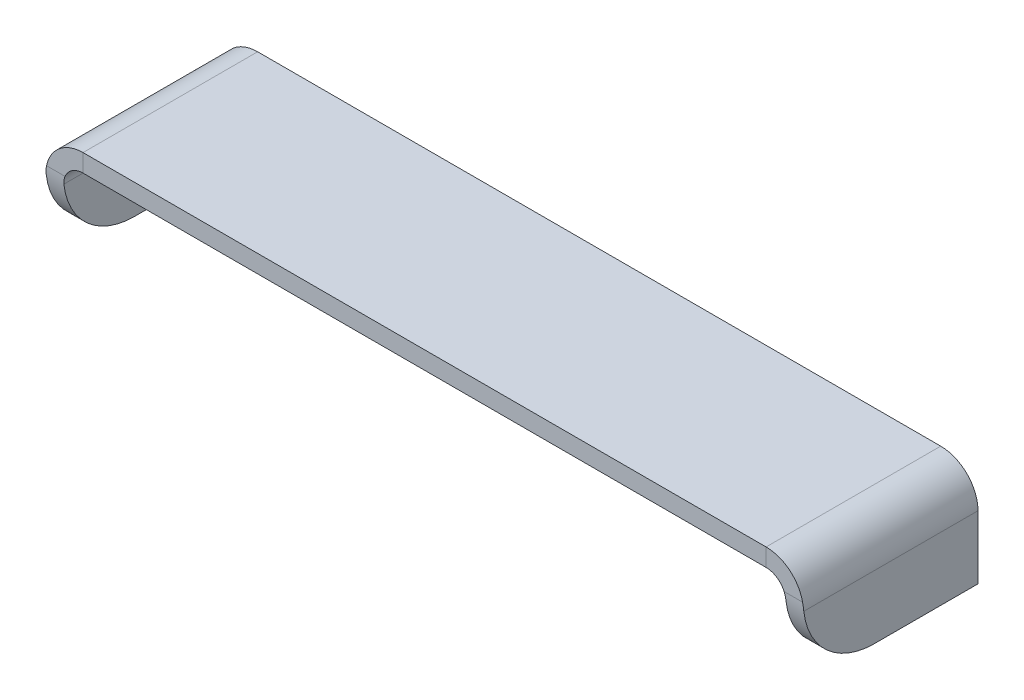
ISO-10303-21;
HEADER;
FILE_DESCRIPTION(('STEP AP214'),'2;1');
FILE_NAME('part.step','',(''),(''),'','','');
FILE_SCHEMA(('AUTOMOTIVE_DESIGN { 1 0 10303 214 1 1 1 1 }'));
ENDSEC;
DATA;
#1=APPLICATION_CONTEXT('core data for automotive mechanical design processes');
#2=APPLICATION_PROTOCOL_DEFINITION('international standard','automotive_design',2000,#1);
#3=PRODUCT_CONTEXT('',#1,'mechanical');
#4=PRODUCT('Part','Part','',(#3));
#5=PRODUCT_RELATED_PRODUCT_CATEGORY('part','',(#4));
#6=PRODUCT_DEFINITION_FORMATION('','',#4);
#7=PRODUCT_DEFINITION_CONTEXT('part definition',#1,'design');
#8=PRODUCT_DEFINITION('design','',#6,#7);
#9=PRODUCT_DEFINITION_SHAPE('','',#8);
#10=(LENGTH_UNIT() NAMED_UNIT(*) SI_UNIT(.MILLI.,.METRE.));
#11=(NAMED_UNIT(*) PLANE_ANGLE_UNIT() SI_UNIT($,.RADIAN.));
#12=(NAMED_UNIT(*) SI_UNIT($,.STERADIAN.) SOLID_ANGLE_UNIT());
#13=UNCERTAINTY_MEASURE_WITH_UNIT(LENGTH_MEASURE(1.E-05),#10,'distance_accuracy_value','');
#14=(GEOMETRIC_REPRESENTATION_CONTEXT(3) GLOBAL_UNCERTAINTY_ASSIGNED_CONTEXT((#13)) GLOBAL_UNIT_ASSIGNED_CONTEXT((#10,
#11,#12)) REPRESENTATION_CONTEXT('',''));
#15=CARTESIAN_POINT('',(0.,0.,0.));
#16=DIRECTION('',(0.,0.,1.));
#17=DIRECTION('',(1.,0.,0.));
#18=AXIS2_PLACEMENT_3D('',#15,#16,#17);
#19=CARTESIAN_POINT('',(0.,-1.5,0.));
#20=DIRECTION('',(0.,-1.,0.));
#21=DIRECTION('',(0.,0.,-1.));
#22=AXIS2_PLACEMENT_3D('',#19,#20,#21);
#23=PLANE('',#22);
#24=DIRECTION('',(-1.,0.,0.));
#25=VECTOR('',#24,1.);
#26=CARTESIAN_POINT('',(0.,-1.5,-14.75));
#27=LINE('',#26,#25);
#28=CARTESIAN_POINT('',(60.85,-1.49999999999999,-14.75));
#29=VERTEX_POINT('',#28);
#30=CARTESIAN_POINT('',(3.14999999999999,-1.5,-14.75));
#31=VERTEX_POINT('',#30);
#32=EDGE_CURVE('E284',#29,#31,#27,.T.);
#33=ORIENTED_EDGE('',*,*,#32,.F.);
#34=DIRECTION('',(0.,0.,1.));
#35=VECTOR('',#34,1.);
#36=CARTESIAN_POINT('',(60.85,-1.49999999999999,0.));
#37=LINE('',#36,#35);
#38=CARTESIAN_POINT('',(60.85,-1.49999999999999,0.));
#39=VERTEX_POINT('',#38);
#40=EDGE_CURVE('E231',#39,#29,#37,.F.);
#41=ORIENTED_EDGE('',*,*,#40,.F.);
#42=DIRECTION('',(1.,0.,0.));
#43=VECTOR('',#42,1.);
#44=CARTESIAN_POINT('',(0.,-1.5,0.));
#45=LINE('',#44,#43);
#46=CARTESIAN_POINT('',(3.14999999999999,-1.5,0.));
#47=VERTEX_POINT('',#46);
#48=EDGE_CURVE('E281',#47,#39,#45,.T.);
#49=ORIENTED_EDGE('',*,*,#48,.F.);
#50=DIRECTION('',(0.,0.,-1.));
#51=VECTOR('',#50,1.);
#52=CARTESIAN_POINT('',(3.14999999999999,-1.5,-14.75));
#53=LINE('',#52,#51);
#54=EDGE_CURVE('E271',#31,#47,#53,.F.);
#55=ORIENTED_EDGE('',*,*,#54,.F.);
#56=EDGE_LOOP('',(#33,#41,#49,#55));
#57=FACE_BOUND('',#56,.T.);
#58=ADVANCED_FACE('F76',(#57),#23,.T.);
#59=CARTESIAN_POINT('',(0.,0.,0.));
#60=DIRECTION('',(0.,-1.,0.));
#61=DIRECTION('',(0.,0.,-1.));
#62=AXIS2_PLACEMENT_3D('',#59,#60,#61);
#63=PLANE('',#62);
#64=DIRECTION('',(0.,0.,1.));
#65=VECTOR('',#64,1.);
#66=CARTESIAN_POINT('',(60.85,0.,0.));
#67=LINE('',#66,#65);
#68=CARTESIAN_POINT('',(60.85,0.,0.));
#69=VERTEX_POINT('',#68);
#70=CARTESIAN_POINT('',(60.85,0.,-14.75));
#71=VERTEX_POINT('',#70);
#72=EDGE_CURVE('E220',#69,#71,#67,.F.);
#73=ORIENTED_EDGE('',*,*,#72,.T.);
#74=DIRECTION('',(-1.,0.,0.));
#75=VECTOR('',#74,1.);
#76=CARTESIAN_POINT('',(0.,0.,-14.75));
#77=LINE('',#76,#75);
#78=CARTESIAN_POINT('',(3.14999999999999,0.,-14.75));
#79=VERTEX_POINT('',#78);
#80=EDGE_CURVE('E285',#71,#79,#77,.T.);
#81=ORIENTED_EDGE('',*,*,#80,.T.);
#82=DIRECTION('',(0.,0.,-1.));
#83=VECTOR('',#82,1.);
#84=CARTESIAN_POINT('',(3.14999999999999,0.,-14.75));
#85=LINE('',#84,#83);
#86=CARTESIAN_POINT('',(3.14999999999999,0.,0.));
#87=VERTEX_POINT('',#86);
#88=EDGE_CURVE('E259',#79,#87,#85,.F.);
#89=ORIENTED_EDGE('',*,*,#88,.T.);
#90=DIRECTION('',(1.,0.,0.));
#91=VECTOR('',#90,1.);
#92=CARTESIAN_POINT('',(0.,0.,0.));
#93=LINE('',#92,#91);
#94=EDGE_CURVE('E279',#87,#69,#93,.T.);
#95=ORIENTED_EDGE('',*,*,#94,.T.);
#96=EDGE_LOOP('',(#73,#81,#89,#95));
#97=FACE_BOUND('',#96,.T.);
#98=ADVANCED_FACE('F393',(#97),#63,.F.);
#99=CARTESIAN_POINT('',(0.,-1.5,0.));
#100=DIRECTION('',(0.,0.,1.));
#101=DIRECTION('',(1.,0.,0.));
#102=AXIS2_PLACEMENT_3D('',#99,#100,#101);
#103=PLANE('',#102);
#104=ORIENTED_EDGE('',*,*,#48,.T.);
#105=DIRECTION('',(0.,1.,0.));
#106=VECTOR('',#105,1.);
#107=CARTESIAN_POINT('',(60.85,-1.49999999999999,0.));
#108=LINE('',#107,#106);
#109=EDGE_CURVE('E226',#39,#69,#108,.T.);
#110=ORIENTED_EDGE('',*,*,#109,.T.);
#111=ORIENTED_EDGE('',*,*,#94,.F.);
#112=DIRECTION('',(0.,1.,0.));
#113=VECTOR('',#112,1.);
#114=CARTESIAN_POINT('',(3.14999999999999,-1.5,0.));
#115=LINE('',#114,#113);
#116=EDGE_CURVE('E276',#47,#87,#115,.T.);
#117=ORIENTED_EDGE('',*,*,#116,.F.);
#118=EDGE_LOOP('',(#104,#110,#111,#117));
#119=FACE_BOUND('',#118,.T.);
#120=ADVANCED_FACE('F378',(#119),#103,.T.);
#121=CARTESIAN_POINT('',(0.,-1.5,-14.75));
#122=DIRECTION('',(0.,0.,-1.));
#123=DIRECTION('',(-1.,0.,0.));
#124=AXIS2_PLACEMENT_3D('',#121,#122,#123);
#125=PLANE('',#124);
#126=DIRECTION('',(0.,1.,0.));
#127=VECTOR('',#126,1.);
#128=CARTESIAN_POINT('',(60.85,-1.49999999999999,-14.75));
#129=LINE('',#128,#127);
#130=EDGE_CURVE('E235',#29,#71,#129,.T.);
#131=ORIENTED_EDGE('',*,*,#130,.F.);
#132=ORIENTED_EDGE('',*,*,#32,.T.);
#133=DIRECTION('',(0.,1.,0.));
#134=VECTOR('',#133,1.);
#135=CARTESIAN_POINT('',(3.14999999999999,-1.5,-14.75));
#136=LINE('',#135,#134);
#137=EDGE_CURVE('E265',#31,#79,#136,.T.);
#138=ORIENTED_EDGE('',*,*,#137,.T.);
#139=ORIENTED_EDGE('',*,*,#80,.F.);
#140=EDGE_LOOP('',(#131,#132,#138,#139));
#141=FACE_BOUND('',#140,.T.);
#142=ADVANCED_FACE('F391',(#141),#125,.T.);
#143=CARTESIAN_POINT('',(3.14999999999999,-3.15,0.));
#144=DIRECTION('',(0.,0.,1.));
#145=DIRECTION('',(1.,0.,0.));
#146=AXIS2_PLACEMENT_3D('',#143,#144,#145);
#147=PLANE('',#146);
#148=CARTESIAN_POINT('',(3.14999999999999,-3.15,0.));
#149=DIRECTION('',(0.,0.,-1.));
#150=DIRECTION('',(-1.,0.,0.));
#151=AXIS2_PLACEMENT_3D('',#148,#149,#150);
#152=CIRCLE('',#151,3.15);
#153=CARTESIAN_POINT('',(0.0677929985155065,-2.5,0.));
#154=VERTEX_POINT('',#153);
#155=EDGE_CURVE('E261',#87,#154,#152,.F.);
#156=ORIENTED_EDGE('',*,*,#155,.T.);
#157=DIRECTION('',(1.,0.,0.));
#158=VECTOR('',#157,1.);
#159=CARTESIAN_POINT('',(1.5,-2.5,0.));
#160=LINE('',#159,#158);
#161=CARTESIAN_POINT('',(1.63342491118968,-2.5,0.));
#162=VERTEX_POINT('',#161);
#163=EDGE_CURVE('E359',#154,#162,#160,.T.);
#164=ORIENTED_EDGE('',*,*,#163,.T.);
#165=CARTESIAN_POINT('',(3.14999999999999,-3.15,0.));
#166=DIRECTION('',(0.,0.,-1.));
#167=DIRECTION('',(-1.,0.,0.));
#168=AXIS2_PLACEMENT_3D('',#165,#166,#167);
#169=CIRCLE('',#168,1.65);
#170=EDGE_CURVE('E268',#47,#162,#169,.F.);
#171=ORIENTED_EDGE('',*,*,#170,.F.);
#172=ORIENTED_EDGE('',*,*,#116,.T.);
#173=EDGE_LOOP('',(#156,#164,#171,#172));
#174=FACE_BOUND('',#173,.T.);
#175=ADVANCED_FACE('F348',(#174),#147,.T.);
#176=CARTESIAN_POINT('',(3.14999999999999,-3.15,-14.75));
#177=DIRECTION('',(0.,0.,1.));
#178=DIRECTION('',(1.,0.,0.));
#179=AXIS2_PLACEMENT_3D('',#176,#177,#178);
#180=PLANE('',#179);
#181=CARTESIAN_POINT('',(3.14999999999999,-3.15,-14.75));
#182=DIRECTION('',(0.,0.,-1.));
#183=DIRECTION('',(-1.,0.,0.));
#184=AXIS2_PLACEMENT_3D('',#181,#182,#183);
#185=CIRCLE('',#184,1.65);
#186=CARTESIAN_POINT('',(1.49999999999999,-3.14999999999999,-14.75));
#187=VERTEX_POINT('',#186);
#188=EDGE_CURVE('E244',#187,#31,#185,.T.);
#189=ORIENTED_EDGE('',*,*,#188,.F.);
#190=DIRECTION('',(1.,0.,0.));
#191=VECTOR('',#190,1.);
#192=CARTESIAN_POINT('',(1.49999999999999,-3.14999999999999,-14.75));
#193=LINE('',#192,#191);
#194=CARTESIAN_POINT('',(0.,-3.14999999999999,-14.75));
#195=VERTEX_POINT('',#194);
#196=EDGE_CURVE('E255',#187,#195,#193,.F.);
#197=ORIENTED_EDGE('',*,*,#196,.T.);
#198=CARTESIAN_POINT('',(3.14999999999999,-3.15,-14.75));
#199=DIRECTION('',(0.,0.,-1.));
#200=DIRECTION('',(-1.,0.,0.));
#201=AXIS2_PLACEMENT_3D('',#198,#199,#200);
#202=CIRCLE('',#201,3.15);
#203=EDGE_CURVE('E262',#195,#79,#202,.T.);
#204=ORIENTED_EDGE('',*,*,#203,.T.);
#205=ORIENTED_EDGE('',*,*,#137,.F.);
#206=EDGE_LOOP('',(#189,#197,#204,#205));
#207=FACE_BOUND('',#206,.T.);
#208=ADVANCED_FACE('F342',(#207),#180,.F.);
#209=CARTESIAN_POINT('',(3.14999999999999,-3.15,-14.75));
#210=DIRECTION('',(0.,0.,-1.));
#211=DIRECTION('',(-1.,0.,0.));
#212=AXIS2_PLACEMENT_3D('',#209,#210,#211);
#213=CYLINDRICAL_SURFACE('',#212,3.15);
#214=DIRECTION('',(0.,0.,-1.));
#215=VECTOR('',#214,1.);
#216=CARTESIAN_POINT('',(0.,-3.14999999999999,0.));
#217=LINE('',#216,#215);
#218=CARTESIAN_POINT('',(0.,-3.14999999999999,-0.0353122462278038));
#219=VERTEX_POINT('',#218);
#220=EDGE_CURVE('E253',#195,#219,#217,.F.);
#221=ORIENTED_EDGE('',*,*,#220,.T.);
#222=CARTESIAN_POINT('',(0.,-3.14999999999999,-0.0353122462278038));
#223=CARTESIAN_POINT('',(-2.72157604559197E-06,-3.0955642227537,-0.0293772175781237));
#224=CARTESIAN_POINT('',(0.00141108282952872,-3.04104612560768,-0.0241930880278406));
#225=CARTESIAN_POINT('',(0.00706713776429791,-2.93222193028,-0.0153408096117983));
#226=CARTESIAN_POINT('',(0.0112996956025828,-2.87791574489005,-0.0116675352312581));
#227=CARTESIAN_POINT('',(0.0225885966013718,-2.76951696706872,-0.00581057313484061));
#228=CARTESIAN_POINT('',(0.0296449396892567,-2.71542437463184,-0.00362688538065571));
#229=CARTESIAN_POINT('',(0.0465913213196935,-2.60745486238356,-0.000717689026238208));
#230=CARTESIAN_POINT('',(0.0564910041714738,-2.55357932035646,2.78822902861687E-06));
#231=CARTESIAN_POINT('',(0.0677929985155063,-2.5,0.));
#232=B_SPLINE_CURVE_WITH_KNOTS('',3,(#222,#223,#224,#225,#226,#227,#228,#229,#230,#231),
.UNSPECIFIED.,.F.,.F.,(4,2,2,2,4),(0.,0.164252289356124,0.327942669857845,0.491633046149946,
0.655885335958661),.UNSPECIFIED.);
#233=EDGE_CURVE('E13',#219,#154,#232,.T.);
#234=ORIENTED_EDGE('',*,*,#233,.T.);
#235=ORIENTED_EDGE('',*,*,#155,.F.);
#236=ORIENTED_EDGE('',*,*,#88,.F.);
#237=ORIENTED_EDGE('',*,*,#203,.F.);
#238=EDGE_LOOP('',(#221,#234,#235,#236,#237));
#239=FACE_BOUND('',#238,.T.);
#240=ADVANCED_FACE('F338',(#239),#213,.T.);
#241=CARTESIAN_POINT('',(3.14999999999999,-3.15,-14.75));
#242=DIRECTION('',(0.,0.,-1.));
#243=DIRECTION('',(-1.,0.,0.));
#244=AXIS2_PLACEMENT_3D('',#241,#242,#243);
#245=CYLINDRICAL_SURFACE('',#244,1.65);
#246=ORIENTED_EDGE('',*,*,#170,.T.);
#247=CARTESIAN_POINT('',(1.63342491118968,-2.5,0.));
#248=CARTESIAN_POINT('',(1.61555035401775,-2.54168949972076,4.37494446540154E-06));
#249=CARTESIAN_POINT('',(1.59940548808023,-2.58412117184793,-0.000434249547036446));
#250=CARTESIAN_POINT('',(1.57066280967659,-2.67016015808351,-0.00226017795007354));
#251=CARTESIAN_POINT('',(1.5580658034225,-2.71376773694091,-0.00364769724232846));
#252=CARTESIAN_POINT('',(1.53670095136038,-2.80106960769241,-0.00740143348581454));
#253=CARTESIAN_POINT('',(1.52787068816604,-2.84474937489398,-0.00975032092107081));
#254=CARTESIAN_POINT('',(1.51378066853783,-2.93259957494961,-0.0154541228184237));
#255=CARTESIAN_POINT('',(1.50851960684693,-2.97676982242248,-0.0188086688633521));
#256=CARTESIAN_POINT('',(1.50167925058175,-3.06398145433164,-0.0264082870173302));
#257=CARTESIAN_POINT('',(1.49999475927723,-3.10701718594078,-0.0306237932248226));
#258=CARTESIAN_POINT('',(1.49999999999999,-3.14999999999999,-0.0353122462278034));
#259=B_SPLINE_CURVE_WITH_KNOTS('',3,(#247,#248,#249,#250,#251,#252,#253,#254,#255,#256,#257,
#258),.UNSPECIFIED.,.F.,.F.,(4,2,2,2,2,4),(0.,0.13603980911279,0.272110506877367,
0.405829464365264,0.539499494431174,0.669180120830109),.UNSPECIFIED.);
#260=CARTESIAN_POINT('',(1.49999999999999,-3.14999999999999,-0.0353122462278038));
#261=VERTEX_POINT('',#260);
#262=EDGE_CURVE('E351',#162,#261,#259,.T.);
#263=ORIENTED_EDGE('',*,*,#262,.T.);
#264=DIRECTION('',(0.,0.,-1.));
#265=VECTOR('',#264,1.);
#266=CARTESIAN_POINT('',(1.49999999999999,-3.14999999999999,0.));
#267=LINE('',#266,#265);
#268=EDGE_CURVE('E238',#261,#187,#267,.T.);
#269=ORIENTED_EDGE('',*,*,#268,.T.);
#270=ORIENTED_EDGE('',*,*,#188,.T.);
#271=ORIENTED_EDGE('',*,*,#54,.T.);
#272=EDGE_LOOP('',(#246,#263,#269,#270,#271));
#273=FACE_BOUND('',#272,.T.);
#274=ADVANCED_FACE('F336',(#273),#245,.F.);
#275=CARTESIAN_POINT('',(0.,-8.49999999999999,-14.75));
#276=DIRECTION('',(0.,0.,1.));
#277=DIRECTION('',(1.,0.,0.));
#278=AXIS2_PLACEMENT_3D('',#275,#276,#277);
#279=PLANE('',#278);
#280=ORIENTED_EDGE('',*,*,#196,.F.);
#281=DIRECTION('',(0.,1.,0.));
#282=VECTOR('',#281,1.);
#283=CARTESIAN_POINT('',(1.49999999999998,-8.5,-14.75));
#284=LINE('',#283,#282);
#285=CARTESIAN_POINT('',(1.49999999999998,-8.5,-14.75));
#286=VERTEX_POINT('',#285);
#287=EDGE_CURVE('E251',#187,#286,#284,.F.);
#288=ORIENTED_EDGE('',*,*,#287,.T.);
#289=DIRECTION('',(1.,0.,0.));
#290=VECTOR('',#289,1.);
#291=CARTESIAN_POINT('',(0.,-8.49999999999999,-14.75));
#292=LINE('',#291,#290);
#293=CARTESIAN_POINT('',(0.,-8.49999999999999,-14.75));
#294=VERTEX_POINT('',#293);
#295=EDGE_CURVE('E241',#294,#286,#292,.T.);
#296=ORIENTED_EDGE('',*,*,#295,.F.);
#297=DIRECTION('',(0.,-1.,0.));
#298=VECTOR('',#297,1.);
#299=CARTESIAN_POINT('',(0.,0.,-14.75));
#300=LINE('',#299,#298);
#301=EDGE_CURVE('E247',#195,#294,#300,.T.);
#302=ORIENTED_EDGE('',*,*,#301,.F.);
#303=EDGE_LOOP('',(#280,#288,#296,#302));
#304=FACE_BOUND('',#303,.T.);
#305=ADVANCED_FACE('F329',(#304),#279,.F.);
#306=CARTESIAN_POINT('',(0.,0.,0.));
#307=DIRECTION('',(1.,0.,0.));
#308=DIRECTION('',(0.,1.,0.));
#309=AXIS2_PLACEMENT_3D('',#306,#307,#308);
#310=PLANE('',#309);
#311=DIRECTION('',(0.,0.,1.));
#312=VECTOR('',#311,1.);
#313=CARTESIAN_POINT('',(0.,-8.49999999999999,0.));
#314=LINE('',#313,#312);
#315=CARTESIAN_POINT('',(0.,-8.49999999999999,-6.));
#316=VERTEX_POINT('',#315);
#317=EDGE_CURVE('E245',#294,#316,#314,.T.);
#318=ORIENTED_EDGE('',*,*,#317,.T.);
#319=CARTESIAN_POINT('',(0.,-2.5,-6.));
#320=DIRECTION('',(1.,0.,0.));
#321=DIRECTION('',(0.,1.,0.));
#322=AXIS2_PLACEMENT_3D('',#319,#320,#321);
#323=CIRCLE('',#322,6.);
#324=EDGE_CURVE('E90',#316,#219,#323,.F.);
#325=ORIENTED_EDGE('',*,*,#324,.T.);
#326=ORIENTED_EDGE('',*,*,#220,.F.);
#327=ORIENTED_EDGE('',*,*,#301,.T.);
#328=EDGE_LOOP('',(#318,#325,#326,#327));
#329=FACE_BOUND('',#328,.T.);
#330=ADVANCED_FACE('F325',(#329),#310,.F.);
#331=CARTESIAN_POINT('',(1.50000000000001,0.,0.));
#332=DIRECTION('',(1.,0.,0.));
#333=DIRECTION('',(0.,1.,0.));
#334=AXIS2_PLACEMENT_3D('',#331,#332,#333);
#335=PLANE('',#334);
#336=ORIENTED_EDGE('',*,*,#268,.F.);
#337=CARTESIAN_POINT('',(1.5,-2.5,-6.));
#338=DIRECTION('',(1.,0.,0.));
#339=DIRECTION('',(0.,1.,0.));
#340=AXIS2_PLACEMENT_3D('',#337,#338,#339);
#341=CIRCLE('',#340,6.);
#342=CARTESIAN_POINT('',(1.49999999999998,-8.5,-6.));
#343=VERTEX_POINT('',#342);
#344=EDGE_CURVE('E358',#261,#343,#341,.T.);
#345=ORIENTED_EDGE('',*,*,#344,.T.);
#346=DIRECTION('',(0.,0.,-1.));
#347=VECTOR('',#346,1.);
#348=CARTESIAN_POINT('',(1.49999999999998,-8.5,0.));
#349=LINE('',#348,#347);
#350=EDGE_CURVE('E249',#286,#343,#349,.F.);
#351=ORIENTED_EDGE('',*,*,#350,.F.);
#352=ORIENTED_EDGE('',*,*,#287,.F.);
#353=EDGE_LOOP('',(#336,#345,#351,#352));
#354=FACE_BOUND('',#353,.T.);
#355=ADVANCED_FACE('F328',(#354),#335,.T.);
#356=CARTESIAN_POINT('',(0.,-8.49999999999999,0.));
#357=DIRECTION('',(0.,1.,0.));
#358=DIRECTION('',(-1.,0.,0.));
#359=AXIS2_PLACEMENT_3D('',#356,#357,#358);
#360=PLANE('',#359);
#361=ORIENTED_EDGE('',*,*,#350,.T.);
#362=DIRECTION('',(1.,0.,0.));
#363=VECTOR('',#362,1.);
#364=CARTESIAN_POINT('',(0.,-8.49999999999999,-6.));
#365=LINE('',#364,#363);
#366=EDGE_CURVE('E104',#343,#316,#365,.F.);
#367=ORIENTED_EDGE('',*,*,#366,.T.);
#368=ORIENTED_EDGE('',*,*,#317,.F.);
#369=ORIENTED_EDGE('',*,*,#295,.T.);
#370=EDGE_LOOP('',(#361,#367,#368,#369));
#371=FACE_BOUND('',#370,.T.);
#372=ADVANCED_FACE('F320',(#371),#360,.F.);
#373=CARTESIAN_POINT('',(60.85,-3.14999999999999,-14.75));
#374=DIRECTION('',(0.,0.,-1.));
#375=DIRECTION('',(-1.,0.,0.));
#376=AXIS2_PLACEMENT_3D('',#373,#374,#375);
#377=PLANE('',#376);
#378=DIRECTION('',(-1.,0.,0.));
#379=VECTOR('',#378,1.);
#380=CARTESIAN_POINT('',(64.,-3.14999999999998,-14.75));
#381=LINE('',#380,#379);
#382=CARTESIAN_POINT('',(62.5,-3.14999999999999,-14.75));
#383=VERTEX_POINT('',#382);
#384=CARTESIAN_POINT('',(64.,-3.14999999999998,-14.75));
#385=VERTEX_POINT('',#384);
#386=EDGE_CURVE('E209',#383,#385,#381,.F.);
#387=ORIENTED_EDGE('',*,*,#386,.F.);
#388=CARTESIAN_POINT('',(60.85,-3.14999999999999,-14.75));
#389=DIRECTION('',(0.,0.,1.));
#390=DIRECTION('',(1.,0.,0.));
#391=AXIS2_PLACEMENT_3D('',#388,#389,#390);
#392=CIRCLE('',#391,1.65);
#393=EDGE_CURVE('E228',#29,#383,#392,.F.);
#394=ORIENTED_EDGE('',*,*,#393,.F.);
#395=ORIENTED_EDGE('',*,*,#130,.T.);
#396=CARTESIAN_POINT('',(60.85,-3.14999999999999,-14.75));
#397=DIRECTION('',(0.,0.,1.));
#398=DIRECTION('',(1.,0.,0.));
#399=AXIS2_PLACEMENT_3D('',#396,#397,#398);
#400=CIRCLE('',#399,3.15);
#401=EDGE_CURVE('E222',#71,#385,#400,.F.);
#402=ORIENTED_EDGE('',*,*,#401,.T.);
#403=EDGE_LOOP('',(#387,#394,#395,#402));
#404=FACE_BOUND('',#403,.T.);
#405=ADVANCED_FACE('F316',(#404),#377,.T.);
#406=CARTESIAN_POINT('',(60.85,-3.14999999999999,0.));
#407=DIRECTION('',(0.,0.,-1.));
#408=DIRECTION('',(-1.,0.,0.));
#409=AXIS2_PLACEMENT_3D('',#406,#407,#408);
#410=PLANE('',#409);
#411=CARTESIAN_POINT('',(60.85,-3.14999999999999,0.));
#412=DIRECTION('',(0.,0.,1.));
#413=DIRECTION('',(1.,0.,0.));
#414=AXIS2_PLACEMENT_3D('',#411,#412,#413);
#415=CIRCLE('',#414,1.65);
#416=CARTESIAN_POINT('',(62.3665750888103,-2.5,0.));
#417=VERTEX_POINT('',#416);
#418=EDGE_CURVE('E205',#417,#39,#415,.T.);
#419=ORIENTED_EDGE('',*,*,#418,.F.);
#420=DIRECTION('',(-1.,0.,0.));
#421=VECTOR('',#420,1.);
#422=CARTESIAN_POINT('',(64.,-2.5,0.));
#423=LINE('',#422,#421);
#424=CARTESIAN_POINT('',(63.9322070014845,-2.5,0.));
#425=VERTEX_POINT('',#424);
#426=EDGE_CURVE('E302',#417,#425,#423,.F.);
#427=ORIENTED_EDGE('',*,*,#426,.T.);
#428=CARTESIAN_POINT('',(60.85,-3.14999999999999,0.));
#429=DIRECTION('',(0.,0.,1.));
#430=DIRECTION('',(1.,0.,0.));
#431=AXIS2_PLACEMENT_3D('',#428,#429,#430);
#432=CIRCLE('',#431,3.15);
#433=EDGE_CURVE('E223',#425,#69,#432,.T.);
#434=ORIENTED_EDGE('',*,*,#433,.T.);
#435=ORIENTED_EDGE('',*,*,#109,.F.);
#436=EDGE_LOOP('',(#419,#427,#434,#435));
#437=FACE_BOUND('',#436,.T.);
#438=ADVANCED_FACE('F319',(#437),#410,.F.);
#439=CARTESIAN_POINT('',(60.85,-3.14999999999999,0.));
#440=DIRECTION('',(0.,0.,1.));
#441=DIRECTION('',(1.,0.,0.));
#442=AXIS2_PLACEMENT_3D('',#439,#440,#441);
#443=CYLINDRICAL_SURFACE('',#442,3.15);
#444=ORIENTED_EDGE('',*,*,#433,.F.);
#445=CARTESIAN_POINT('',(63.9322070014845,-2.5,0.));
#446=CARTESIAN_POINT('',(63.9435089958285,-2.55357932035646,2.78822902895922E-06));
#447=CARTESIAN_POINT('',(63.9534086786803,-2.60745486238356,-0.000717689026237843));
#448=CARTESIAN_POINT('',(63.9703550603107,-2.71542437463183,-0.00362688538065527));
#449=CARTESIAN_POINT('',(63.9774114033986,-2.76951696706872,-0.00581057313484013));
#450=CARTESIAN_POINT('',(63.9887003043974,-2.87791574489005,-0.0116675352312575));
#451=CARTESIAN_POINT('',(63.9929328622357,-2.93222193028,-0.0153408096117977));
#452=CARTESIAN_POINT('',(63.9985889171705,-3.04104612560768,-0.0241930880278398));
#453=CARTESIAN_POINT('',(64.0000027215761,-3.0955642227537,-0.0293772175781229));
#454=CARTESIAN_POINT('',(64.,-3.14999999999998,-0.035312246227803));
#455=B_SPLINE_CURVE_WITH_KNOTS('',3,(#445,#446,#447,#448,#449,#450,#451,#452,#453,#454),
.UNSPECIFIED.,.F.,.F.,(4,2,2,2,4),(0.,0.164252289808713,0.327942666100812,0.491633046602531,
0.655885335958655),.UNSPECIFIED.);
#456=CARTESIAN_POINT('',(64.,-3.14999999999998,-0.0353122462278029));
#457=VERTEX_POINT('',#456);
#458=EDGE_CURVE('E405',#425,#457,#455,.T.);
#459=ORIENTED_EDGE('',*,*,#458,.T.);
#460=DIRECTION('',(0.,0.,1.));
#461=VECTOR('',#460,1.);
#462=CARTESIAN_POINT('',(64.,-3.14999999999998,-14.75));
#463=LINE('',#462,#461);
#464=EDGE_CURVE('E214',#457,#385,#463,.F.);
#465=ORIENTED_EDGE('',*,*,#464,.T.);
#466=ORIENTED_EDGE('',*,*,#401,.F.);
#467=ORIENTED_EDGE('',*,*,#72,.F.);
#468=EDGE_LOOP('',(#444,#459,#465,#466,#467));
#469=FACE_BOUND('',#468,.T.);
#470=ADVANCED_FACE('F312',(#469),#443,.T.);
#471=CARTESIAN_POINT('',(60.85,-3.14999999999999,0.));
#472=DIRECTION('',(0.,0.,1.));
#473=DIRECTION('',(1.,0.,0.));
#474=AXIS2_PLACEMENT_3D('',#471,#472,#473);
#475=CYLINDRICAL_SURFACE('',#474,1.65);
#476=DIRECTION('',(0.,0.,1.));
#477=VECTOR('',#476,1.);
#478=CARTESIAN_POINT('',(62.5,-3.14999999999999,-14.75));
#479=LINE('',#478,#477);
#480=CARTESIAN_POINT('',(62.5,-3.14999999999999,-0.0353122462278029));
#481=VERTEX_POINT('',#480);
#482=EDGE_CURVE('E216',#383,#481,#479,.T.);
#483=ORIENTED_EDGE('',*,*,#482,.T.);
#484=CARTESIAN_POINT('',(62.5,-3.14999999999999,-0.0353122462278029));
#485=CARTESIAN_POINT('',(62.4999977956798,-3.10489321461496,-0.0303946987493229));
#486=CARTESIAN_POINT('',(62.4981482527294,-3.05976163343192,-0.0259971357311511));
#487=CARTESIAN_POINT('',(62.4907425824656,-2.96968877659914,-0.0182414141251706));
#488=CARTESIAN_POINT('',(62.4851844023027,-2.92474762022827,-0.0148838327084597));
#489=CARTESIAN_POINT('',(62.4632063027968,-2.79229780775383,-0.00648234779069901));
#490=CARTESIAN_POINT('',(62.4414810076203,-2.70547508512327,-0.00292838523357675));
#491=CARTESIAN_POINT('',(62.4060213026307,-2.60066598689045,-0.000809026229681373));
#492=CARTESIAN_POINT('',(62.3987063633093,-2.58037174319065,-0.000504179595286965));
#493=CARTESIAN_POINT('',(62.3832528704143,-2.53999811620605,-9.95409591527095E-05));
#494=CARTESIAN_POINT('',(62.3751109440917,-2.51992001494024,-6.27177069145269E-07));
#495=CARTESIAN_POINT('',(62.3665750888103,-2.5,0.));
#496=B_SPLINE_CURVE_WITH_KNOTS('',3,(#484,#485,#486,#487,#488,#489,#490,#491,#492,#493,#494,
#495),.UNSPECIFIED.,.F.,.F.,(4,2,2,2,2,4),(0.,0.136017514760913,0.272110382099776,
0.539265013302637,0.603980823664789,0.668972059931097),.UNSPECIFIED.);
#497=EDGE_CURVE('E295',#481,#417,#496,.T.);
#498=ORIENTED_EDGE('',*,*,#497,.T.);
#499=ORIENTED_EDGE('',*,*,#418,.T.);
#500=ORIENTED_EDGE('',*,*,#40,.T.);
#501=ORIENTED_EDGE('',*,*,#393,.T.);
#502=EDGE_LOOP('',(#483,#498,#499,#500,#501));
#503=FACE_BOUND('',#502,.T.);
#504=ADVANCED_FACE('F307',(#503),#475,.F.);
#505=CARTESIAN_POINT('',(64.,-1.49999999999999,-14.75));
#506=DIRECTION('',(0.,0.,1.));
#507=DIRECTION('',(1.,0.,0.));
#508=AXIS2_PLACEMENT_3D('',#505,#506,#507);
#509=PLANE('',#508);
#510=ORIENTED_EDGE('',*,*,#386,.T.);
#511=DIRECTION('',(0.,1.,0.));
#512=VECTOR('',#511,1.);
#513=CARTESIAN_POINT('',(64.,2.59002484779729E-13,-14.75));
#514=LINE('',#513,#512);
#515=CARTESIAN_POINT('',(64.,-8.49999999999999,-14.75));
#516=VERTEX_POINT('',#515);
#517=EDGE_CURVE('E189',#516,#385,#514,.T.);
#518=ORIENTED_EDGE('',*,*,#517,.F.);
#519=DIRECTION('',(-1.,0.,0.));
#520=VECTOR('',#519,1.);
#521=CARTESIAN_POINT('',(64.,-8.49999999999999,-14.75));
#522=LINE('',#521,#520);
#523=CARTESIAN_POINT('',(62.5,-8.5,-14.75));
#524=VERTEX_POINT('',#523);
#525=EDGE_CURVE('E198',#516,#524,#522,.T.);
#526=ORIENTED_EDGE('',*,*,#525,.T.);
#527=DIRECTION('',(0.,-1.,0.));
#528=VECTOR('',#527,1.);
#529=CARTESIAN_POINT('',(62.5,-1.5,-14.75));
#530=LINE('',#529,#528);
#531=EDGE_CURVE('E195',#524,#383,#530,.F.);
#532=ORIENTED_EDGE('',*,*,#531,.T.);
#533=EDGE_LOOP('',(#510,#518,#526,#532));
#534=FACE_BOUND('',#533,.T.);
#535=ADVANCED_FACE('F208',(#534),#509,.F.);
#536=CARTESIAN_POINT('',(64.,2.59002484779729E-13,0.));
#537=DIRECTION('',(-1.,0.,0.));
#538=DIRECTION('',(0.,-1.,0.));
#539=AXIS2_PLACEMENT_3D('',#536,#537,#538);
#540=PLANE('',#539);
#541=ORIENTED_EDGE('',*,*,#464,.F.);
#542=CARTESIAN_POINT('',(64.,-2.5,-6.));
#543=DIRECTION('',(-1.,0.,0.));
#544=DIRECTION('',(0.,-1.,0.));
#545=AXIS2_PLACEMENT_3D('',#542,#543,#544);
#546=CIRCLE('',#545,6.);
#547=CARTESIAN_POINT('',(64.,-8.49999999999999,-6.));
#548=VERTEX_POINT('',#547);
#549=EDGE_CURVE('E191',#457,#548,#546,.F.);
#550=ORIENTED_EDGE('',*,*,#549,.T.);
#551=DIRECTION('',(0.,0.,-1.));
#552=VECTOR('',#551,1.);
#553=CARTESIAN_POINT('',(64.,-8.49999999999999,0.));
#554=LINE('',#553,#552);
#555=EDGE_CURVE('E184',#548,#516,#554,.T.);
#556=ORIENTED_EDGE('',*,*,#555,.T.);
#557=ORIENTED_EDGE('',*,*,#517,.T.);
#558=EDGE_LOOP('',(#541,#550,#556,#557));
#559=FACE_BOUND('',#558,.T.);
#560=ADVANCED_FACE('F187',(#559),#540,.F.);
#561=CARTESIAN_POINT('',(62.5,2.53765262771464E-13,0.));
#562=DIRECTION('',(-1.,0.,0.));
#563=DIRECTION('',(0.,-1.,0.));
#564=AXIS2_PLACEMENT_3D('',#561,#562,#563);
#565=PLANE('',#564);
#566=DIRECTION('',(0.,0.,1.));
#567=VECTOR('',#566,1.);
#568=CARTESIAN_POINT('',(62.5,-8.5,-14.75));
#569=LINE('',#568,#567);
#570=CARTESIAN_POINT('',(62.5,-8.5,-6.));
#571=VERTEX_POINT('',#570);
#572=EDGE_CURVE('E201',#571,#524,#569,.F.);
#573=ORIENTED_EDGE('',*,*,#572,.F.);
#574=CARTESIAN_POINT('',(62.5,-2.5,-6.));
#575=DIRECTION('',(-1.,0.,0.));
#576=DIRECTION('',(0.,-1.,0.));
#577=AXIS2_PLACEMENT_3D('',#574,#575,#576);
#578=CIRCLE('',#577,6.);
#579=EDGE_CURVE('E293',#571,#481,#578,.T.);
#580=ORIENTED_EDGE('',*,*,#579,.T.);
#581=ORIENTED_EDGE('',*,*,#482,.F.);
#582=ORIENTED_EDGE('',*,*,#531,.F.);
#583=EDGE_LOOP('',(#573,#580,#581,#582));
#584=FACE_BOUND('',#583,.T.);
#585=ADVANCED_FACE('F411',(#584),#565,.T.);
#586=CARTESIAN_POINT('',(64.,-8.49999999999999,-14.75));
#587=DIRECTION('',(0.,1.,0.));
#588=DIRECTION('',(-1.,0.,0.));
#589=AXIS2_PLACEMENT_3D('',#586,#587,#588);
#590=PLANE('',#589);
#591=ORIENTED_EDGE('',*,*,#555,.F.);
#592=DIRECTION('',(1.,0.,0.));
#593=VECTOR('',#592,1.);
#594=CARTESIAN_POINT('',(62.5,-8.5,-6.));
#595=LINE('',#594,#593);
#596=EDGE_CURVE('E287',#548,#571,#595,.F.);
#597=ORIENTED_EDGE('',*,*,#596,.T.);
#598=ORIENTED_EDGE('',*,*,#572,.T.);
#599=ORIENTED_EDGE('',*,*,#525,.F.);
#600=EDGE_LOOP('',(#591,#597,#598,#599));
#601=FACE_BOUND('',#600,.T.);
#602=ADVANCED_FACE('F199',(#601),#590,.F.);
#603=CARTESIAN_POINT('',(64.,-2.5,-6.));
#604=DIRECTION('',(-1.,0.,0.));
#605=DIRECTION('',(0.,-1.,0.));
#606=AXIS2_PLACEMENT_3D('',#603,#604,#605);
#607=CYLINDRICAL_SURFACE('',#606,6.);
#608=ORIENTED_EDGE('',*,*,#458,.F.);
#609=ORIENTED_EDGE('',*,*,#426,.F.);
#610=ORIENTED_EDGE('',*,*,#497,.F.);
#611=ORIENTED_EDGE('',*,*,#579,.F.);
#612=ORIENTED_EDGE('',*,*,#596,.F.);
#613=ORIENTED_EDGE('',*,*,#549,.F.);
#614=EDGE_LOOP('',(#608,#609,#610,#611,#612,#613));
#615=FACE_BOUND('',#614,.T.);
#616=ADVANCED_FACE('F304',(#615),#607,.T.);
#617=CARTESIAN_POINT('',(3.15,-2.50000000000001,-6.));
#618=DIRECTION('',(-1.,0.,0.));
#619=DIRECTION('',(0.,-1.,0.));
#620=AXIS2_PLACEMENT_3D('',#617,#618,#619);
#621=CYLINDRICAL_SURFACE('',#620,6.);
#622=ORIENTED_EDGE('',*,*,#324,.F.);
#623=ORIENTED_EDGE('',*,*,#366,.F.);
#624=ORIENTED_EDGE('',*,*,#344,.F.);
#625=ORIENTED_EDGE('',*,*,#262,.F.);
#626=ORIENTED_EDGE('',*,*,#163,.F.);
#627=ORIENTED_EDGE('',*,*,#233,.F.);
#628=EDGE_LOOP('',(#622,#623,#624,#625,#626,#627));
#629=FACE_BOUND('',#628,.T.);
#630=ADVANCED_FACE('F78',(#629),#621,.T.);
#631=CLOSED_SHELL('',(#58,#98,#120,#142,#175,#208,#240,#274,#305,#330,#355,#372,#405,#438,#470,
#504,#535,#560,#585,#602,#616,#630));
#632=MANIFOLD_SOLID_BREP('B2',#631);
#633=ADVANCED_BREP_SHAPE_REPRESENTATION('',(#18,#632),#14);
#634=SHAPE_DEFINITION_REPRESENTATION(#9,#633);
ENDSEC;
END-ISO-10303-21;
